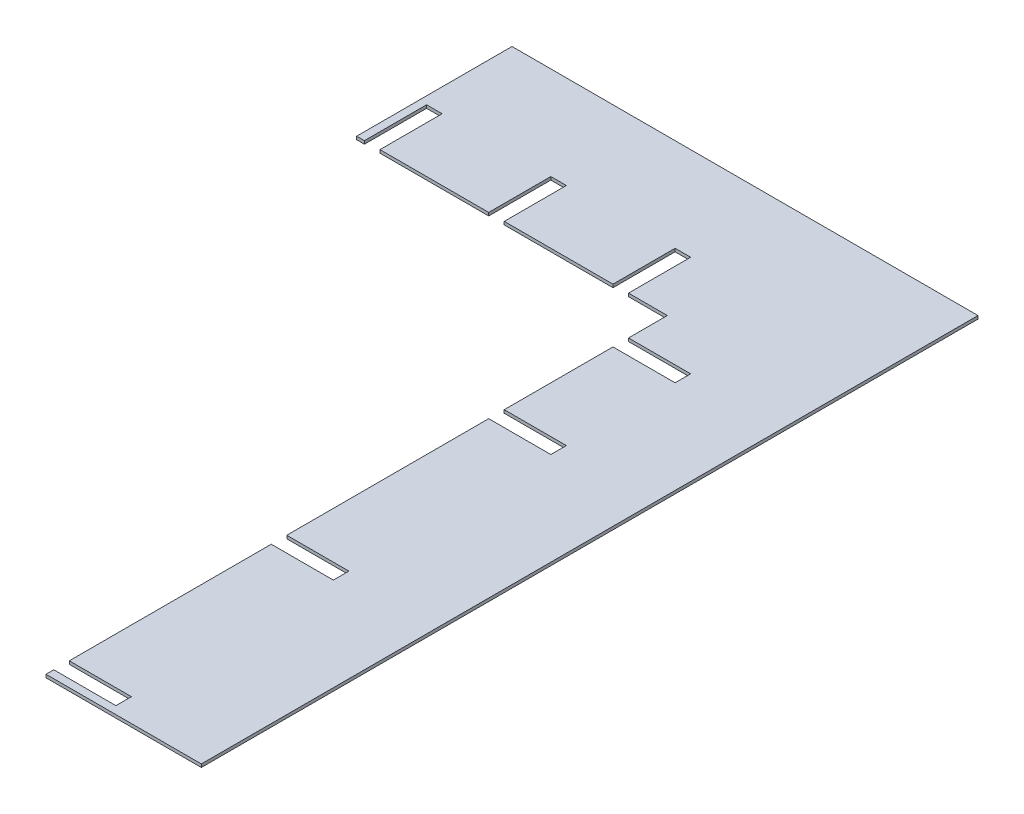
ISO-10303-21;
HEADER;
FILE_DESCRIPTION(('STEP AP214'),'2;1');
FILE_NAME('part.step','',(''),(''),'','','');
FILE_SCHEMA(('AUTOMOTIVE_DESIGN { 1 0 10303 214 1 1 1 1 }'));
ENDSEC;
DATA;
#1=APPLICATION_CONTEXT('core data for automotive mechanical design processes');
#2=APPLICATION_PROTOCOL_DEFINITION('international standard','automotive_design',2000,#1);
#3=PRODUCT_CONTEXT('',#1,'mechanical');
#4=PRODUCT('Part','Part','',(#3));
#5=PRODUCT_RELATED_PRODUCT_CATEGORY('part','',(#4));
#6=PRODUCT_DEFINITION_FORMATION('','',#4);
#7=PRODUCT_DEFINITION_CONTEXT('part definition',#1,'design');
#8=PRODUCT_DEFINITION('design','',#6,#7);
#9=PRODUCT_DEFINITION_SHAPE('','',#8);
#10=(LENGTH_UNIT() NAMED_UNIT(*) SI_UNIT(.MILLI.,.METRE.));
#11=(NAMED_UNIT(*) PLANE_ANGLE_UNIT() SI_UNIT($,.RADIAN.));
#12=(NAMED_UNIT(*) SI_UNIT($,.STERADIAN.) SOLID_ANGLE_UNIT());
#13=UNCERTAINTY_MEASURE_WITH_UNIT(LENGTH_MEASURE(1.E-05),#10,'distance_accuracy_value','');
#14=(GEOMETRIC_REPRESENTATION_CONTEXT(3) GLOBAL_UNCERTAINTY_ASSIGNED_CONTEXT((#13)) GLOBAL_UNIT_ASSIGNED_CONTEXT((#10,
#11,#12)) REPRESENTATION_CONTEXT('',''));
#15=CARTESIAN_POINT('',(0.,0.,0.));
#16=DIRECTION('',(0.,0.,1.));
#17=DIRECTION('',(1.,0.,0.));
#18=AXIS2_PLACEMENT_3D('',#15,#16,#17);
#19=CARTESIAN_POINT('',(0.,1.,-50.));
#20=DIRECTION('',(1.,0.,0.));
#21=DIRECTION('',(0.,0.,-1.));
#22=AXIS2_PLACEMENT_3D('',#19,#20,#21);
#23=PLANE('',#22);
#24=DIRECTION('',(0.,0.,1.));
#25=VECTOR('',#24,1.);
#26=CARTESIAN_POINT('',(0.,0.,-50.));
#27=LINE('',#26,#25);
#28=CARTESIAN_POINT('',(0.,0.,-50.));
#29=VERTEX_POINT('',#28);
#30=CARTESIAN_POINT('',(0.,0.,0.));
#31=VERTEX_POINT('',#30);
#32=EDGE_CURVE('E285',#29,#31,#27,.T.);
#33=ORIENTED_EDGE('',*,*,#32,.T.);
#34=DIRECTION('',(0.,-1.,0.));
#35=VECTOR('',#34,1.);
#36=CARTESIAN_POINT('',(0.,1.,0.));
#37=LINE('',#36,#35);
#38=CARTESIAN_POINT('',(0.,1.,0.));
#39=VERTEX_POINT('',#38);
#40=EDGE_CURVE('E11',#39,#31,#37,.T.);
#41=ORIENTED_EDGE('',*,*,#40,.F.);
#42=DIRECTION('',(0.,0.,1.));
#43=VECTOR('',#42,1.);
#44=CARTESIAN_POINT('',(0.,1.,-50.));
#45=LINE('',#44,#43);
#46=CARTESIAN_POINT('',(0.,1.,-50.));
#47=VERTEX_POINT('',#46);
#48=EDGE_CURVE('E351',#47,#39,#45,.T.);
#49=ORIENTED_EDGE('',*,*,#48,.F.);
#50=DIRECTION('',(0.,-1.,0.));
#51=VECTOR('',#50,1.);
#52=CARTESIAN_POINT('',(0.,1.,-50.));
#53=LINE('',#52,#51);
#54=EDGE_CURVE('E281',#47,#29,#53,.T.);
#55=ORIENTED_EDGE('',*,*,#54,.T.);
#56=EDGE_LOOP('',(#33,#41,#49,#55));
#57=FACE_BOUND('',#56,.T.);
#58=ADVANCED_FACE('F33',(#57),#23,.F.);
#59=CARTESIAN_POINT('',(0.,1.,0.));
#60=DIRECTION('',(0.,0.,-1.));
#61=DIRECTION('',(-1.,0.,0.));
#62=AXIS2_PLACEMENT_3D('',#59,#60,#61);
#63=PLANE('',#62);
#64=DIRECTION('',(1.,0.,0.));
#65=VECTOR('',#64,1.);
#66=CARTESIAN_POINT('',(0.,0.,0.));
#67=LINE('',#66,#65);
#68=CARTESIAN_POINT('',(2.5,0.,0.));
#69=VERTEX_POINT('',#68);
#70=EDGE_CURVE('E288',#31,#69,#67,.T.);
#71=ORIENTED_EDGE('',*,*,#70,.T.);
#72=DIRECTION('',(0.,-1.,0.));
#73=VECTOR('',#72,1.);
#74=CARTESIAN_POINT('',(2.5,1.,0.));
#75=LINE('',#74,#73);
#76=CARTESIAN_POINT('',(2.5,1.,0.));
#77=VERTEX_POINT('',#76);
#78=EDGE_CURVE('E41',#77,#69,#75,.T.);
#79=ORIENTED_EDGE('',*,*,#78,.F.);
#80=DIRECTION('',(1.,0.,0.));
#81=VECTOR('',#80,1.);
#82=CARTESIAN_POINT('',(0.,1.,0.));
#83=LINE('',#82,#81);
#84=EDGE_CURVE('E170',#39,#77,#83,.T.);
#85=ORIENTED_EDGE('',*,*,#84,.F.);
#86=ORIENTED_EDGE('',*,*,#40,.T.);
#87=EDGE_LOOP('',(#71,#79,#85,#86));
#88=FACE_BOUND('',#87,.T.);
#89=ADVANCED_FACE('F539',(#88),#63,.F.);
#90=CARTESIAN_POINT('',(2.5,1.,0.));
#91=DIRECTION('',(-1.,0.,0.));
#92=DIRECTION('',(0.,0.,1.));
#93=AXIS2_PLACEMENT_3D('',#90,#91,#92);
#94=PLANE('',#93);
#95=DIRECTION('',(0.,0.,-1.));
#96=VECTOR('',#95,1.);
#97=CARTESIAN_POINT('',(2.5,0.,0.));
#98=LINE('',#97,#96);
#99=CARTESIAN_POINT('',(2.5,0.,-20.));
#100=VERTEX_POINT('',#99);
#101=EDGE_CURVE('E290',#69,#100,#98,.T.);
#102=ORIENTED_EDGE('',*,*,#101,.T.);
#103=DIRECTION('',(0.,-1.,0.));
#104=VECTOR('',#103,1.);
#105=CARTESIAN_POINT('',(2.5,1.,-20.));
#106=LINE('',#105,#104);
#107=CARTESIAN_POINT('',(2.5,1.,-20.));
#108=VERTEX_POINT('',#107);
#109=EDGE_CURVE('E436',#108,#100,#106,.T.);
#110=ORIENTED_EDGE('',*,*,#109,.F.);
#111=DIRECTION('',(0.,0.,-1.));
#112=VECTOR('',#111,1.);
#113=CARTESIAN_POINT('',(2.5,1.,0.));
#114=LINE('',#113,#112);
#115=EDGE_CURVE('E444',#77,#108,#114,.T.);
#116=ORIENTED_EDGE('',*,*,#115,.F.);
#117=ORIENTED_EDGE('',*,*,#78,.T.);
#118=EDGE_LOOP('',(#102,#110,#116,#117));
#119=FACE_BOUND('',#118,.T.);
#120=ADVANCED_FACE('F442',(#119),#94,.F.);
#121=CARTESIAN_POINT('',(2.5,1.,-20.));
#122=DIRECTION('',(0.,0.,-1.));
#123=DIRECTION('',(-1.,0.,0.));
#124=AXIS2_PLACEMENT_3D('',#121,#122,#123);
#125=PLANE('',#124);
#126=DIRECTION('',(1.,0.,0.));
#127=VECTOR('',#126,1.);
#128=CARTESIAN_POINT('',(2.5,0.,-20.));
#129=LINE('',#128,#127);
#130=CARTESIAN_POINT('',(7.50000000000001,0.,-20.));
#131=VERTEX_POINT('',#130);
#132=EDGE_CURVE('E292',#100,#131,#129,.T.);
#133=ORIENTED_EDGE('',*,*,#132,.T.);
#134=DIRECTION('',(0.,-1.,0.));
#135=VECTOR('',#134,1.);
#136=CARTESIAN_POINT('',(7.50000000000001,1.,-20.));
#137=LINE('',#136,#135);
#138=CARTESIAN_POINT('',(7.50000000000001,1.,-20.));
#139=VERTEX_POINT('',#138);
#140=EDGE_CURVE('E433',#139,#131,#137,.T.);
#141=ORIENTED_EDGE('',*,*,#140,.F.);
#142=DIRECTION('',(1.,0.,0.));
#143=VECTOR('',#142,1.);
#144=CARTESIAN_POINT('',(2.5,1.,-20.));
#145=LINE('',#144,#143);
#146=EDGE_CURVE('E462',#108,#139,#145,.T.);
#147=ORIENTED_EDGE('',*,*,#146,.F.);
#148=ORIENTED_EDGE('',*,*,#109,.T.);
#149=EDGE_LOOP('',(#133,#141,#147,#148));
#150=FACE_BOUND('',#149,.T.);
#151=ADVANCED_FACE('F453',(#150),#125,.F.);
#152=CARTESIAN_POINT('',(7.50000000000001,1.,-20.));
#153=DIRECTION('',(1.,0.,0.));
#154=DIRECTION('',(0.,0.,-1.));
#155=AXIS2_PLACEMENT_3D('',#152,#153,#154);
#156=PLANE('',#155);
#157=DIRECTION('',(0.,0.,1.));
#158=VECTOR('',#157,1.);
#159=CARTESIAN_POINT('',(7.50000000000001,0.,-20.));
#160=LINE('',#159,#158);
#161=CARTESIAN_POINT('',(7.50000000000001,0.,0.));
#162=VERTEX_POINT('',#161);
#163=EDGE_CURVE('E294',#131,#162,#160,.T.);
#164=ORIENTED_EDGE('',*,*,#163,.T.);
#165=DIRECTION('',(0.,-1.,0.));
#166=VECTOR('',#165,1.);
#167=CARTESIAN_POINT('',(7.50000000000001,1.,0.));
#168=LINE('',#167,#166);
#169=CARTESIAN_POINT('',(7.50000000000001,1.,0.));
#170=VERTEX_POINT('',#169);
#171=EDGE_CURVE('E430',#170,#162,#168,.T.);
#172=ORIENTED_EDGE('',*,*,#171,.F.);
#173=DIRECTION('',(0.,0.,1.));
#174=VECTOR('',#173,1.);
#175=CARTESIAN_POINT('',(7.50000000000001,1.,-20.));
#176=LINE('',#175,#174);
#177=EDGE_CURVE('E459',#139,#170,#176,.T.);
#178=ORIENTED_EDGE('',*,*,#177,.F.);
#179=ORIENTED_EDGE('',*,*,#140,.T.);
#180=EDGE_LOOP('',(#164,#172,#178,#179));
#181=FACE_BOUND('',#180,.T.);
#182=ADVANCED_FACE('F457',(#181),#156,.F.);
#183=CARTESIAN_POINT('',(7.50000000000001,1.,0.));
#184=DIRECTION('',(0.,0.,-1.));
#185=DIRECTION('',(-1.,0.,0.));
#186=AXIS2_PLACEMENT_3D('',#183,#184,#185);
#187=PLANE('',#186);
#188=DIRECTION('',(1.,0.,0.));
#189=VECTOR('',#188,1.);
#190=CARTESIAN_POINT('',(7.50000000000001,0.,0.));
#191=LINE('',#190,#189);
#192=CARTESIAN_POINT('',(42.5,0.,0.));
#193=VERTEX_POINT('',#192);
#194=EDGE_CURVE('E296',#162,#193,#191,.T.);
#195=ORIENTED_EDGE('',*,*,#194,.T.);
#196=DIRECTION('',(0.,-1.,0.));
#197=VECTOR('',#196,1.);
#198=CARTESIAN_POINT('',(42.5,1.,0.));
#199=LINE('',#198,#197);
#200=CARTESIAN_POINT('',(42.5,1.,0.));
#201=VERTEX_POINT('',#200);
#202=EDGE_CURVE('E427',#201,#193,#199,.T.);
#203=ORIENTED_EDGE('',*,*,#202,.F.);
#204=DIRECTION('',(1.,0.,0.));
#205=VECTOR('',#204,1.);
#206=CARTESIAN_POINT('',(7.50000000000001,1.,0.));
#207=LINE('',#206,#205);
#208=EDGE_CURVE('E461',#170,#201,#207,.T.);
#209=ORIENTED_EDGE('',*,*,#208,.F.);
#210=ORIENTED_EDGE('',*,*,#171,.T.);
#211=EDGE_LOOP('',(#195,#203,#209,#210));
#212=FACE_BOUND('',#211,.T.);
#213=ADVANCED_FACE('F552',(#212),#187,.F.);
#214=CARTESIAN_POINT('',(42.5,1.,0.));
#215=DIRECTION('',(-1.,0.,0.));
#216=DIRECTION('',(0.,0.,1.));
#217=AXIS2_PLACEMENT_3D('',#214,#215,#216);
#218=PLANE('',#217);
#219=DIRECTION('',(0.,0.,-1.));
#220=VECTOR('',#219,1.);
#221=CARTESIAN_POINT('',(42.5,0.,0.));
#222=LINE('',#221,#220);
#223=CARTESIAN_POINT('',(42.5,0.,-20.));
#224=VERTEX_POINT('',#223);
#225=EDGE_CURVE('E298',#193,#224,#222,.T.);
#226=ORIENTED_EDGE('',*,*,#225,.T.);
#227=DIRECTION('',(0.,-1.,0.));
#228=VECTOR('',#227,1.);
#229=CARTESIAN_POINT('',(42.5,1.,-20.));
#230=LINE('',#229,#228);
#231=CARTESIAN_POINT('',(42.5,1.,-20.));
#232=VERTEX_POINT('',#231);
#233=EDGE_CURVE('E424',#232,#224,#230,.T.);
#234=ORIENTED_EDGE('',*,*,#233,.F.);
#235=DIRECTION('',(0.,0.,-1.));
#236=VECTOR('',#235,1.);
#237=CARTESIAN_POINT('',(42.5,1.,0.));
#238=LINE('',#237,#236);
#239=EDGE_CURVE('E464',#201,#232,#238,.T.);
#240=ORIENTED_EDGE('',*,*,#239,.F.);
#241=ORIENTED_EDGE('',*,*,#202,.T.);
#242=EDGE_LOOP('',(#226,#234,#240,#241));
#243=FACE_BOUND('',#242,.T.);
#244=ADVANCED_FACE('F555',(#243),#218,.F.);
#245=CARTESIAN_POINT('',(42.5,1.,-20.));
#246=DIRECTION('',(0.,0.,-1.));
#247=DIRECTION('',(-1.,0.,0.));
#248=AXIS2_PLACEMENT_3D('',#245,#246,#247);
#249=PLANE('',#248);
#250=DIRECTION('',(1.,0.,0.));
#251=VECTOR('',#250,1.);
#252=CARTESIAN_POINT('',(42.5,0.,-20.));
#253=LINE('',#252,#251);
#254=CARTESIAN_POINT('',(47.5,0.,-20.));
#255=VERTEX_POINT('',#254);
#256=EDGE_CURVE('E300',#224,#255,#253,.T.);
#257=ORIENTED_EDGE('',*,*,#256,.T.);
#258=DIRECTION('',(0.,-1.,0.));
#259=VECTOR('',#258,1.);
#260=CARTESIAN_POINT('',(47.5,1.,-20.));
#261=LINE('',#260,#259);
#262=CARTESIAN_POINT('',(47.5,1.,-20.));
#263=VERTEX_POINT('',#262);
#264=EDGE_CURVE('E421',#263,#255,#261,.T.);
#265=ORIENTED_EDGE('',*,*,#264,.F.);
#266=DIRECTION('',(1.,0.,0.));
#267=VECTOR('',#266,1.);
#268=CARTESIAN_POINT('',(42.5,1.,-20.));
#269=LINE('',#268,#267);
#270=EDGE_CURVE('E470',#232,#263,#269,.T.);
#271=ORIENTED_EDGE('',*,*,#270,.F.);
#272=ORIENTED_EDGE('',*,*,#233,.T.);
#273=EDGE_LOOP('',(#257,#265,#271,#272));
#274=FACE_BOUND('',#273,.T.);
#275=ADVANCED_FACE('F559',(#274),#249,.F.);
#276=CARTESIAN_POINT('',(47.5,1.,-20.));
#277=DIRECTION('',(1.,0.,0.));
#278=DIRECTION('',(0.,0.,-1.));
#279=AXIS2_PLACEMENT_3D('',#276,#277,#278);
#280=PLANE('',#279);
#281=DIRECTION('',(0.,0.,1.));
#282=VECTOR('',#281,1.);
#283=CARTESIAN_POINT('',(47.5,0.,-20.));
#284=LINE('',#283,#282);
#285=CARTESIAN_POINT('',(47.5,0.,0.));
#286=VERTEX_POINT('',#285);
#287=EDGE_CURVE('E302',#255,#286,#284,.T.);
#288=ORIENTED_EDGE('',*,*,#287,.T.);
#289=DIRECTION('',(0.,-1.,0.));
#290=VECTOR('',#289,1.);
#291=CARTESIAN_POINT('',(47.5,1.,0.));
#292=LINE('',#291,#290);
#293=CARTESIAN_POINT('',(47.5,1.,0.));
#294=VERTEX_POINT('',#293);
#295=EDGE_CURVE('E418',#294,#286,#292,.T.);
#296=ORIENTED_EDGE('',*,*,#295,.F.);
#297=DIRECTION('',(0.,0.,1.));
#298=VECTOR('',#297,1.);
#299=CARTESIAN_POINT('',(47.5,1.,-20.));
#300=LINE('',#299,#298);
#301=EDGE_CURVE('E472',#263,#294,#300,.T.);
#302=ORIENTED_EDGE('',*,*,#301,.F.);
#303=ORIENTED_EDGE('',*,*,#264,.T.);
#304=EDGE_LOOP('',(#288,#296,#302,#303));
#305=FACE_BOUND('',#304,.T.);
#306=ADVANCED_FACE('F563',(#305),#280,.F.);
#307=CARTESIAN_POINT('',(47.5,1.,0.));
#308=DIRECTION('',(0.,0.,-1.));
#309=DIRECTION('',(-1.,0.,0.));
#310=AXIS2_PLACEMENT_3D('',#307,#308,#309);
#311=PLANE('',#310);
#312=DIRECTION('',(1.,0.,0.));
#313=VECTOR('',#312,1.);
#314=CARTESIAN_POINT('',(47.5,0.,0.));
#315=LINE('',#314,#313);
#316=CARTESIAN_POINT('',(82.5,0.,0.));
#317=VERTEX_POINT('',#316);
#318=EDGE_CURVE('E304',#286,#317,#315,.T.);
#319=ORIENTED_EDGE('',*,*,#318,.T.);
#320=DIRECTION('',(0.,-1.,0.));
#321=VECTOR('',#320,1.);
#322=CARTESIAN_POINT('',(82.5,1.,0.));
#323=LINE('',#322,#321);
#324=CARTESIAN_POINT('',(82.5,1.,0.));
#325=VERTEX_POINT('',#324);
#326=EDGE_CURVE('E415',#325,#317,#323,.T.);
#327=ORIENTED_EDGE('',*,*,#326,.F.);
#328=DIRECTION('',(1.,0.,0.));
#329=VECTOR('',#328,1.);
#330=CARTESIAN_POINT('',(47.5,1.,0.));
#331=LINE('',#330,#329);
#332=EDGE_CURVE('E474',#294,#325,#331,.T.);
#333=ORIENTED_EDGE('',*,*,#332,.F.);
#334=ORIENTED_EDGE('',*,*,#295,.T.);
#335=EDGE_LOOP('',(#319,#327,#333,#334));
#336=FACE_BOUND('',#335,.T.);
#337=ADVANCED_FACE('F567',(#336),#311,.F.);
#338=CARTESIAN_POINT('',(82.5,1.,0.));
#339=DIRECTION('',(-1.,0.,0.));
#340=DIRECTION('',(0.,0.,1.));
#341=AXIS2_PLACEMENT_3D('',#338,#339,#340);
#342=PLANE('',#341);
#343=DIRECTION('',(0.,0.,-1.));
#344=VECTOR('',#343,1.);
#345=CARTESIAN_POINT('',(82.5,0.,0.));
#346=LINE('',#345,#344);
#347=CARTESIAN_POINT('',(82.5,0.,-20.));
#348=VERTEX_POINT('',#347);
#349=EDGE_CURVE('E306',#317,#348,#346,.T.);
#350=ORIENTED_EDGE('',*,*,#349,.T.);
#351=DIRECTION('',(0.,-1.,0.));
#352=VECTOR('',#351,1.);
#353=CARTESIAN_POINT('',(82.5,1.,-20.));
#354=LINE('',#353,#352);
#355=CARTESIAN_POINT('',(82.5,1.,-20.));
#356=VERTEX_POINT('',#355);
#357=EDGE_CURVE('E412',#356,#348,#354,.T.);
#358=ORIENTED_EDGE('',*,*,#357,.F.);
#359=DIRECTION('',(0.,0.,-1.));
#360=VECTOR('',#359,1.);
#361=CARTESIAN_POINT('',(82.5,1.,0.));
#362=LINE('',#361,#360);
#363=EDGE_CURVE('E476',#325,#356,#362,.T.);
#364=ORIENTED_EDGE('',*,*,#363,.F.);
#365=ORIENTED_EDGE('',*,*,#326,.T.);
#366=EDGE_LOOP('',(#350,#358,#364,#365));
#367=FACE_BOUND('',#366,.T.);
#368=ADVANCED_FACE('F571',(#367),#342,.F.);
#369=CARTESIAN_POINT('',(82.5,1.,-20.));
#370=DIRECTION('',(0.,0.,-1.));
#371=DIRECTION('',(-1.,0.,0.));
#372=AXIS2_PLACEMENT_3D('',#369,#370,#371);
#373=PLANE('',#372);
#374=DIRECTION('',(1.,0.,0.));
#375=VECTOR('',#374,1.);
#376=CARTESIAN_POINT('',(82.5,0.,-20.));
#377=LINE('',#376,#375);
#378=CARTESIAN_POINT('',(87.5,0.,-20.));
#379=VERTEX_POINT('',#378);
#380=EDGE_CURVE('E308',#348,#379,#377,.T.);
#381=ORIENTED_EDGE('',*,*,#380,.T.);
#382=DIRECTION('',(0.,-1.,0.));
#383=VECTOR('',#382,1.);
#384=CARTESIAN_POINT('',(87.5,1.,-20.));
#385=LINE('',#384,#383);
#386=CARTESIAN_POINT('',(87.5,1.,-20.));
#387=VERTEX_POINT('',#386);
#388=EDGE_CURVE('E409',#387,#379,#385,.T.);
#389=ORIENTED_EDGE('',*,*,#388,.F.);
#390=DIRECTION('',(1.,0.,0.));
#391=VECTOR('',#390,1.);
#392=CARTESIAN_POINT('',(82.5,1.,-20.));
#393=LINE('',#392,#391);
#394=EDGE_CURVE('E478',#356,#387,#393,.T.);
#395=ORIENTED_EDGE('',*,*,#394,.F.);
#396=ORIENTED_EDGE('',*,*,#357,.T.);
#397=EDGE_LOOP('',(#381,#389,#395,#396));
#398=FACE_BOUND('',#397,.T.);
#399=ADVANCED_FACE('F575',(#398),#373,.F.);
#400=CARTESIAN_POINT('',(87.5,1.,-20.));
#401=DIRECTION('',(1.,0.,0.));
#402=DIRECTION('',(0.,0.,-1.));
#403=AXIS2_PLACEMENT_3D('',#400,#401,#402);
#404=PLANE('',#403);
#405=DIRECTION('',(0.,0.,1.));
#406=VECTOR('',#405,1.);
#407=CARTESIAN_POINT('',(87.5,0.,-20.));
#408=LINE('',#407,#406);
#409=CARTESIAN_POINT('',(87.5,0.,0.));
#410=VERTEX_POINT('',#409);
#411=EDGE_CURVE('E310',#379,#410,#408,.T.);
#412=ORIENTED_EDGE('',*,*,#411,.T.);
#413=DIRECTION('',(0.,-1.,0.));
#414=VECTOR('',#413,1.);
#415=CARTESIAN_POINT('',(87.5,1.,0.));
#416=LINE('',#415,#414);
#417=CARTESIAN_POINT('',(87.5,1.,0.));
#418=VERTEX_POINT('',#417);
#419=EDGE_CURVE('E406',#418,#410,#416,.T.);
#420=ORIENTED_EDGE('',*,*,#419,.F.);
#421=DIRECTION('',(0.,0.,1.));
#422=VECTOR('',#421,1.);
#423=CARTESIAN_POINT('',(87.5,1.,-20.));
#424=LINE('',#423,#422);
#425=EDGE_CURVE('E480',#387,#418,#424,.T.);
#426=ORIENTED_EDGE('',*,*,#425,.F.);
#427=ORIENTED_EDGE('',*,*,#388,.T.);
#428=EDGE_LOOP('',(#412,#420,#426,#427));
#429=FACE_BOUND('',#428,.T.);
#430=ADVANCED_FACE('F579',(#429),#404,.F.);
#431=CARTESIAN_POINT('',(87.5,1.,0.));
#432=DIRECTION('',(0.,0.,-1.));
#433=DIRECTION('',(-1.,0.,0.));
#434=AXIS2_PLACEMENT_3D('',#431,#432,#433);
#435=PLANE('',#434);
#436=DIRECTION('',(1.,0.,0.));
#437=VECTOR('',#436,1.);
#438=CARTESIAN_POINT('',(87.5,0.,0.));
#439=LINE('',#438,#437);
#440=CARTESIAN_POINT('',(100.,0.,0.));
#441=VERTEX_POINT('',#440);
#442=EDGE_CURVE('E312',#410,#441,#439,.T.);
#443=ORIENTED_EDGE('',*,*,#442,.T.);
#444=DIRECTION('',(0.,-1.,0.));
#445=VECTOR('',#444,1.);
#446=CARTESIAN_POINT('',(100.,1.,0.));
#447=LINE('',#446,#445);
#448=CARTESIAN_POINT('',(100.,1.,0.));
#449=VERTEX_POINT('',#448);
#450=EDGE_CURVE('E403',#449,#441,#447,.T.);
#451=ORIENTED_EDGE('',*,*,#450,.F.);
#452=DIRECTION('',(1.,0.,0.));
#453=VECTOR('',#452,1.);
#454=CARTESIAN_POINT('',(87.5,1.,0.));
#455=LINE('',#454,#453);
#456=EDGE_CURVE('E482',#418,#449,#455,.T.);
#457=ORIENTED_EDGE('',*,*,#456,.F.);
#458=ORIENTED_EDGE('',*,*,#419,.T.);
#459=EDGE_LOOP('',(#443,#451,#457,#458));
#460=FACE_BOUND('',#459,.T.);
#461=ADVANCED_FACE('F583',(#460),#435,.F.);
#462=CARTESIAN_POINT('',(100.,1.,0.));
#463=DIRECTION('',(1.,0.,0.));
#464=DIRECTION('',(0.,0.,-1.));
#465=AXIS2_PLACEMENT_3D('',#462,#463,#464);
#466=PLANE('',#465);
#467=DIRECTION('',(0.,0.,1.));
#468=VECTOR('',#467,1.);
#469=CARTESIAN_POINT('',(100.,0.,0.));
#470=LINE('',#469,#468);
#471=CARTESIAN_POINT('',(100.,0.,12.5));
#472=VERTEX_POINT('',#471);
#473=EDGE_CURVE('E314',#441,#472,#470,.T.);
#474=ORIENTED_EDGE('',*,*,#473,.T.);
#475=DIRECTION('',(0.,-1.,0.));
#476=VECTOR('',#475,1.);
#477=CARTESIAN_POINT('',(100.,1.,12.5));
#478=LINE('',#477,#476);
#479=CARTESIAN_POINT('',(100.,1.,12.5));
#480=VERTEX_POINT('',#479);
#481=EDGE_CURVE('E400',#480,#472,#478,.T.);
#482=ORIENTED_EDGE('',*,*,#481,.F.);
#483=DIRECTION('',(0.,0.,1.));
#484=VECTOR('',#483,1.);
#485=CARTESIAN_POINT('',(100.,1.,0.));
#486=LINE('',#485,#484);
#487=EDGE_CURVE('E484',#449,#480,#486,.T.);
#488=ORIENTED_EDGE('',*,*,#487,.F.);
#489=ORIENTED_EDGE('',*,*,#450,.T.);
#490=EDGE_LOOP('',(#474,#482,#488,#489));
#491=FACE_BOUND('',#490,.T.);
#492=ADVANCED_FACE('F587',(#491),#466,.F.);
#493=CARTESIAN_POINT('',(120.,1.,12.5));
#494=DIRECTION('',(0.,0.,-1.));
#495=DIRECTION('',(-1.,0.,0.));
#496=AXIS2_PLACEMENT_3D('',#493,#494,#495);
#497=PLANE('',#496);
#498=DIRECTION('',(1.,0.,0.));
#499=VECTOR('',#498,1.);
#500=CARTESIAN_POINT('',(120.,0.,12.5));
#501=LINE('',#500,#499);
#502=CARTESIAN_POINT('',(120.,0.,12.5));
#503=VERTEX_POINT('',#502);
#504=EDGE_CURVE('E316',#472,#503,#501,.T.);
#505=ORIENTED_EDGE('',*,*,#504,.T.);
#506=DIRECTION('',(0.,-1.,0.));
#507=VECTOR('',#506,1.);
#508=CARTESIAN_POINT('',(120.,1.,12.5));
#509=LINE('',#508,#507);
#510=CARTESIAN_POINT('',(120.,1.,12.5));
#511=VERTEX_POINT('',#510);
#512=EDGE_CURVE('E397',#511,#503,#509,.T.);
#513=ORIENTED_EDGE('',*,*,#512,.F.);
#514=DIRECTION('',(1.,0.,0.));
#515=VECTOR('',#514,1.);
#516=CARTESIAN_POINT('',(120.,1.,12.5));
#517=LINE('',#516,#515);
#518=EDGE_CURVE('E486',#480,#511,#517,.T.);
#519=ORIENTED_EDGE('',*,*,#518,.F.);
#520=ORIENTED_EDGE('',*,*,#481,.T.);
#521=EDGE_LOOP('',(#505,#513,#519,#520));
#522=FACE_BOUND('',#521,.T.);
#523=ADVANCED_FACE('F591',(#522),#497,.F.);
#524=CARTESIAN_POINT('',(120.,1.,17.5));
#525=DIRECTION('',(1.,0.,0.));
#526=DIRECTION('',(0.,0.,-1.));
#527=AXIS2_PLACEMENT_3D('',#524,#525,#526);
#528=PLANE('',#527);
#529=DIRECTION('',(0.,0.,1.));
#530=VECTOR('',#529,1.);
#531=CARTESIAN_POINT('',(120.,0.,17.5));
#532=LINE('',#531,#530);
#533=CARTESIAN_POINT('',(120.,0.,17.5));
#534=VERTEX_POINT('',#533);
#535=EDGE_CURVE('E318',#503,#534,#532,.T.);
#536=ORIENTED_EDGE('',*,*,#535,.T.);
#537=DIRECTION('',(0.,-1.,0.));
#538=VECTOR('',#537,1.);
#539=CARTESIAN_POINT('',(120.,1.,17.5));
#540=LINE('',#539,#538);
#541=CARTESIAN_POINT('',(120.,1.,17.5));
#542=VERTEX_POINT('',#541);
#543=EDGE_CURVE('E394',#542,#534,#540,.T.);
#544=ORIENTED_EDGE('',*,*,#543,.F.);
#545=DIRECTION('',(0.,0.,1.));
#546=VECTOR('',#545,1.);
#547=CARTESIAN_POINT('',(120.,1.,17.5));
#548=LINE('',#547,#546);
#549=EDGE_CURVE('E488',#511,#542,#548,.T.);
#550=ORIENTED_EDGE('',*,*,#549,.F.);
#551=ORIENTED_EDGE('',*,*,#512,.T.);
#552=EDGE_LOOP('',(#536,#544,#550,#551));
#553=FACE_BOUND('',#552,.T.);
#554=ADVANCED_FACE('F595',(#553),#528,.F.);
#555=CARTESIAN_POINT('',(100.,1.,17.5));
#556=DIRECTION('',(0.,0.,1.));
#557=DIRECTION('',(1.,0.,0.));
#558=AXIS2_PLACEMENT_3D('',#555,#556,#557);
#559=PLANE('',#558);
#560=DIRECTION('',(-1.,0.,0.));
#561=VECTOR('',#560,1.);
#562=CARTESIAN_POINT('',(100.,0.,17.5));
#563=LINE('',#562,#561);
#564=CARTESIAN_POINT('',(100.,0.,17.5));
#565=VERTEX_POINT('',#564);
#566=EDGE_CURVE('E320',#534,#565,#563,.T.);
#567=ORIENTED_EDGE('',*,*,#566,.T.);
#568=DIRECTION('',(0.,-1.,0.));
#569=VECTOR('',#568,1.);
#570=CARTESIAN_POINT('',(100.,1.,17.5));
#571=LINE('',#570,#569);
#572=CARTESIAN_POINT('',(100.,1.,17.5));
#573=VERTEX_POINT('',#572);
#574=EDGE_CURVE('E391',#573,#565,#571,.T.);
#575=ORIENTED_EDGE('',*,*,#574,.F.);
#576=DIRECTION('',(-1.,0.,0.));
#577=VECTOR('',#576,1.);
#578=CARTESIAN_POINT('',(100.,1.,17.5));
#579=LINE('',#578,#577);
#580=EDGE_CURVE('E490',#542,#573,#579,.T.);
#581=ORIENTED_EDGE('',*,*,#580,.F.);
#582=ORIENTED_EDGE('',*,*,#543,.T.);
#583=EDGE_LOOP('',(#567,#575,#581,#582));
#584=FACE_BOUND('',#583,.T.);
#585=ADVANCED_FACE('F599',(#584),#559,.F.);
#586=CARTESIAN_POINT('',(100.,1.,17.5));
#587=DIRECTION('',(1.,0.,0.));
#588=DIRECTION('',(0.,0.,-1.));
#589=AXIS2_PLACEMENT_3D('',#586,#587,#588);
#590=PLANE('',#589);
#591=DIRECTION('',(0.,0.,1.));
#592=VECTOR('',#591,1.);
#593=CARTESIAN_POINT('',(100.,0.,17.5));
#594=LINE('',#593,#592);
#595=CARTESIAN_POINT('',(100.,0.,52.5));
#596=VERTEX_POINT('',#595);
#597=EDGE_CURVE('E322',#565,#596,#594,.T.);
#598=ORIENTED_EDGE('',*,*,#597,.T.);
#599=DIRECTION('',(0.,-1.,0.));
#600=VECTOR('',#599,1.);
#601=CARTESIAN_POINT('',(100.,1.,52.5));
#602=LINE('',#601,#600);
#603=CARTESIAN_POINT('',(100.,1.,52.5));
#604=VERTEX_POINT('',#603);
#605=EDGE_CURVE('E388',#604,#596,#602,.T.);
#606=ORIENTED_EDGE('',*,*,#605,.F.);
#607=DIRECTION('',(0.,0.,1.));
#608=VECTOR('',#607,1.);
#609=CARTESIAN_POINT('',(100.,1.,17.5));
#610=LINE('',#609,#608);
#611=EDGE_CURVE('E492',#573,#604,#610,.T.);
#612=ORIENTED_EDGE('',*,*,#611,.F.);
#613=ORIENTED_EDGE('',*,*,#574,.T.);
#614=EDGE_LOOP('',(#598,#606,#612,#613));
#615=FACE_BOUND('',#614,.T.);
#616=ADVANCED_FACE('F603',(#615),#590,.F.);
#617=CARTESIAN_POINT('',(120.,1.,52.5));
#618=DIRECTION('',(0.,0.,-1.));
#619=DIRECTION('',(-1.,0.,0.));
#620=AXIS2_PLACEMENT_3D('',#617,#618,#619);
#621=PLANE('',#620);
#622=DIRECTION('',(1.,0.,0.));
#623=VECTOR('',#622,1.);
#624=CARTESIAN_POINT('',(120.,0.,52.5));
#625=LINE('',#624,#623);
#626=CARTESIAN_POINT('',(120.,0.,52.5));
#627=VERTEX_POINT('',#626);
#628=EDGE_CURVE('E324',#596,#627,#625,.T.);
#629=ORIENTED_EDGE('',*,*,#628,.T.);
#630=DIRECTION('',(0.,-1.,0.));
#631=VECTOR('',#630,1.);
#632=CARTESIAN_POINT('',(120.,1.,52.5));
#633=LINE('',#632,#631);
#634=CARTESIAN_POINT('',(120.,1.,52.5));
#635=VERTEX_POINT('',#634);
#636=EDGE_CURVE('E385',#635,#627,#633,.T.);
#637=ORIENTED_EDGE('',*,*,#636,.F.);
#638=DIRECTION('',(1.,0.,0.));
#639=VECTOR('',#638,1.);
#640=CARTESIAN_POINT('',(120.,1.,52.5));
#641=LINE('',#640,#639);
#642=EDGE_CURVE('E494',#604,#635,#641,.T.);
#643=ORIENTED_EDGE('',*,*,#642,.F.);
#644=ORIENTED_EDGE('',*,*,#605,.T.);
#645=EDGE_LOOP('',(#629,#637,#643,#644));
#646=FACE_BOUND('',#645,.T.);
#647=ADVANCED_FACE('F607',(#646),#621,.F.);
#648=CARTESIAN_POINT('',(120.,1.,57.5));
#649=DIRECTION('',(1.,0.,0.));
#650=DIRECTION('',(0.,0.,-1.));
#651=AXIS2_PLACEMENT_3D('',#648,#649,#650);
#652=PLANE('',#651);
#653=DIRECTION('',(0.,0.,1.));
#654=VECTOR('',#653,1.);
#655=CARTESIAN_POINT('',(120.,0.,57.5));
#656=LINE('',#655,#654);
#657=CARTESIAN_POINT('',(120.,0.,57.5));
#658=VERTEX_POINT('',#657);
#659=EDGE_CURVE('E326',#627,#658,#656,.T.);
#660=ORIENTED_EDGE('',*,*,#659,.T.);
#661=DIRECTION('',(0.,-1.,0.));
#662=VECTOR('',#661,1.);
#663=CARTESIAN_POINT('',(120.,1.,57.5));
#664=LINE('',#663,#662);
#665=CARTESIAN_POINT('',(120.,1.,57.5));
#666=VERTEX_POINT('',#665);
#667=EDGE_CURVE('E382',#666,#658,#664,.T.);
#668=ORIENTED_EDGE('',*,*,#667,.F.);
#669=DIRECTION('',(0.,0.,1.));
#670=VECTOR('',#669,1.);
#671=CARTESIAN_POINT('',(120.,1.,57.5));
#672=LINE('',#671,#670);
#673=EDGE_CURVE('E496',#635,#666,#672,.T.);
#674=ORIENTED_EDGE('',*,*,#673,.F.);
#675=ORIENTED_EDGE('',*,*,#636,.T.);
#676=EDGE_LOOP('',(#660,#668,#674,#675));
#677=FACE_BOUND('',#676,.T.);
#678=ADVANCED_FACE('F611',(#677),#652,.F.);
#679=CARTESIAN_POINT('',(100.,1.,57.5));
#680=DIRECTION('',(0.,0.,1.));
#681=DIRECTION('',(1.,0.,0.));
#682=AXIS2_PLACEMENT_3D('',#679,#680,#681);
#683=PLANE('',#682);
#684=DIRECTION('',(-1.,0.,0.));
#685=VECTOR('',#684,1.);
#686=CARTESIAN_POINT('',(100.,0.,57.5));
#687=LINE('',#686,#685);
#688=CARTESIAN_POINT('',(100.,0.,57.5));
#689=VERTEX_POINT('',#688);
#690=EDGE_CURVE('E328',#658,#689,#687,.T.);
#691=ORIENTED_EDGE('',*,*,#690,.T.);
#692=DIRECTION('',(0.,-1.,0.));
#693=VECTOR('',#692,1.);
#694=CARTESIAN_POINT('',(100.,1.,57.5));
#695=LINE('',#694,#693);
#696=CARTESIAN_POINT('',(100.,1.,57.5));
#697=VERTEX_POINT('',#696);
#698=EDGE_CURVE('E379',#697,#689,#695,.T.);
#699=ORIENTED_EDGE('',*,*,#698,.F.);
#700=DIRECTION('',(-1.,0.,0.));
#701=VECTOR('',#700,1.);
#702=CARTESIAN_POINT('',(100.,1.,57.5));
#703=LINE('',#702,#701);
#704=EDGE_CURVE('E498',#666,#697,#703,.T.);
#705=ORIENTED_EDGE('',*,*,#704,.F.);
#706=ORIENTED_EDGE('',*,*,#667,.T.);
#707=EDGE_LOOP('',(#691,#699,#705,#706));
#708=FACE_BOUND('',#707,.T.);
#709=ADVANCED_FACE('F615',(#708),#683,.F.);
#710=CARTESIAN_POINT('',(100.,1.,57.5));
#711=DIRECTION('',(1.,0.,0.));
#712=DIRECTION('',(0.,0.,-1.));
#713=AXIS2_PLACEMENT_3D('',#710,#711,#712);
#714=PLANE('',#713);
#715=DIRECTION('',(0.,0.,1.));
#716=VECTOR('',#715,1.);
#717=CARTESIAN_POINT('',(100.,0.,57.5));
#718=LINE('',#717,#716);
#719=CARTESIAN_POINT('',(100.,0.,122.5));
#720=VERTEX_POINT('',#719);
#721=EDGE_CURVE('E330',#689,#720,#718,.T.);
#722=ORIENTED_EDGE('',*,*,#721,.T.);
#723=DIRECTION('',(0.,-1.,0.));
#724=VECTOR('',#723,1.);
#725=CARTESIAN_POINT('',(100.,1.,122.5));
#726=LINE('',#725,#724);
#727=CARTESIAN_POINT('',(100.,1.,122.5));
#728=VERTEX_POINT('',#727);
#729=EDGE_CURVE('E376',#728,#720,#726,.T.);
#730=ORIENTED_EDGE('',*,*,#729,.F.);
#731=DIRECTION('',(0.,0.,1.));
#732=VECTOR('',#731,1.);
#733=CARTESIAN_POINT('',(100.,1.,57.5));
#734=LINE('',#733,#732);
#735=EDGE_CURVE('E500',#697,#728,#734,.T.);
#736=ORIENTED_EDGE('',*,*,#735,.F.);
#737=ORIENTED_EDGE('',*,*,#698,.T.);
#738=EDGE_LOOP('',(#722,#730,#736,#737));
#739=FACE_BOUND('',#738,.T.);
#740=ADVANCED_FACE('F619',(#739),#714,.F.);
#741=CARTESIAN_POINT('',(120.,1.,122.5));
#742=DIRECTION('',(0.,0.,-1.));
#743=DIRECTION('',(-1.,0.,0.));
#744=AXIS2_PLACEMENT_3D('',#741,#742,#743);
#745=PLANE('',#744);
#746=DIRECTION('',(1.,0.,0.));
#747=VECTOR('',#746,1.);
#748=CARTESIAN_POINT('',(120.,0.,122.5));
#749=LINE('',#748,#747);
#750=CARTESIAN_POINT('',(120.,0.,122.5));
#751=VERTEX_POINT('',#750);
#752=EDGE_CURVE('E332',#720,#751,#749,.T.);
#753=ORIENTED_EDGE('',*,*,#752,.T.);
#754=DIRECTION('',(0.,-1.,0.));
#755=VECTOR('',#754,1.);
#756=CARTESIAN_POINT('',(120.,1.,122.5));
#757=LINE('',#756,#755);
#758=CARTESIAN_POINT('',(120.,1.,122.5));
#759=VERTEX_POINT('',#758);
#760=EDGE_CURVE('E373',#759,#751,#757,.T.);
#761=ORIENTED_EDGE('',*,*,#760,.F.);
#762=DIRECTION('',(1.,0.,0.));
#763=VECTOR('',#762,1.);
#764=CARTESIAN_POINT('',(120.,1.,122.5));
#765=LINE('',#764,#763);
#766=EDGE_CURVE('E502',#728,#759,#765,.T.);
#767=ORIENTED_EDGE('',*,*,#766,.F.);
#768=ORIENTED_EDGE('',*,*,#729,.T.);
#769=EDGE_LOOP('',(#753,#761,#767,#768));
#770=FACE_BOUND('',#769,.T.);
#771=ADVANCED_FACE('F623',(#770),#745,.F.);
#772=CARTESIAN_POINT('',(120.,1.,127.5));
#773=DIRECTION('',(1.,0.,0.));
#774=DIRECTION('',(0.,0.,-1.));
#775=AXIS2_PLACEMENT_3D('',#772,#773,#774);
#776=PLANE('',#775);
#777=DIRECTION('',(0.,0.,1.));
#778=VECTOR('',#777,1.);
#779=CARTESIAN_POINT('',(120.,0.,127.5));
#780=LINE('',#779,#778);
#781=CARTESIAN_POINT('',(120.,0.,127.5));
#782=VERTEX_POINT('',#781);
#783=EDGE_CURVE('E334',#751,#782,#780,.T.);
#784=ORIENTED_EDGE('',*,*,#783,.T.);
#785=DIRECTION('',(0.,-1.,0.));
#786=VECTOR('',#785,1.);
#787=CARTESIAN_POINT('',(120.,1.,127.5));
#788=LINE('',#787,#786);
#789=CARTESIAN_POINT('',(120.,1.,127.5));
#790=VERTEX_POINT('',#789);
#791=EDGE_CURVE('E370',#790,#782,#788,.T.);
#792=ORIENTED_EDGE('',*,*,#791,.F.);
#793=DIRECTION('',(0.,0.,1.));
#794=VECTOR('',#793,1.);
#795=CARTESIAN_POINT('',(120.,1.,127.5));
#796=LINE('',#795,#794);
#797=EDGE_CURVE('E504',#759,#790,#796,.T.);
#798=ORIENTED_EDGE('',*,*,#797,.F.);
#799=ORIENTED_EDGE('',*,*,#760,.T.);
#800=EDGE_LOOP('',(#784,#792,#798,#799));
#801=FACE_BOUND('',#800,.T.);
#802=ADVANCED_FACE('F627',(#801),#776,.F.);
#803=CARTESIAN_POINT('',(100.,1.,127.5));
#804=DIRECTION('',(0.,0.,1.));
#805=DIRECTION('',(1.,0.,0.));
#806=AXIS2_PLACEMENT_3D('',#803,#804,#805);
#807=PLANE('',#806);
#808=DIRECTION('',(-1.,0.,0.));
#809=VECTOR('',#808,1.);
#810=CARTESIAN_POINT('',(100.,0.,127.5));
#811=LINE('',#810,#809);
#812=CARTESIAN_POINT('',(100.,0.,127.5));
#813=VERTEX_POINT('',#812);
#814=EDGE_CURVE('E336',#782,#813,#811,.T.);
#815=ORIENTED_EDGE('',*,*,#814,.T.);
#816=DIRECTION('',(0.,-1.,0.));
#817=VECTOR('',#816,1.);
#818=CARTESIAN_POINT('',(100.,1.,127.5));
#819=LINE('',#818,#817);
#820=CARTESIAN_POINT('',(100.,1.,127.5));
#821=VERTEX_POINT('',#820);
#822=EDGE_CURVE('E367',#821,#813,#819,.T.);
#823=ORIENTED_EDGE('',*,*,#822,.F.);
#824=DIRECTION('',(-1.,0.,0.));
#825=VECTOR('',#824,1.);
#826=CARTESIAN_POINT('',(100.,1.,127.5));
#827=LINE('',#826,#825);
#828=EDGE_CURVE('E506',#790,#821,#827,.T.);
#829=ORIENTED_EDGE('',*,*,#828,.F.);
#830=ORIENTED_EDGE('',*,*,#791,.T.);
#831=EDGE_LOOP('',(#815,#823,#829,#830));
#832=FACE_BOUND('',#831,.T.);
#833=ADVANCED_FACE('F631',(#832),#807,.F.);
#834=CARTESIAN_POINT('',(100.,1.,127.5));
#835=DIRECTION('',(1.,0.,0.));
#836=DIRECTION('',(0.,0.,-1.));
#837=AXIS2_PLACEMENT_3D('',#834,#835,#836);
#838=PLANE('',#837);
#839=DIRECTION('',(0.,0.,1.));
#840=VECTOR('',#839,1.);
#841=CARTESIAN_POINT('',(100.,0.,127.5));
#842=LINE('',#841,#840);
#843=CARTESIAN_POINT('',(100.,0.,192.5));
#844=VERTEX_POINT('',#843);
#845=EDGE_CURVE('E338',#813,#844,#842,.T.);
#846=ORIENTED_EDGE('',*,*,#845,.T.);
#847=DIRECTION('',(0.,-1.,0.));
#848=VECTOR('',#847,1.);
#849=CARTESIAN_POINT('',(100.,1.,192.5));
#850=LINE('',#849,#848);
#851=CARTESIAN_POINT('',(100.,1.,192.5));
#852=VERTEX_POINT('',#851);
#853=EDGE_CURVE('E364',#852,#844,#850,.T.);
#854=ORIENTED_EDGE('',*,*,#853,.F.);
#855=DIRECTION('',(0.,0.,1.));
#856=VECTOR('',#855,1.);
#857=CARTESIAN_POINT('',(100.,1.,127.5));
#858=LINE('',#857,#856);
#859=EDGE_CURVE('E508',#821,#852,#858,.T.);
#860=ORIENTED_EDGE('',*,*,#859,.F.);
#861=ORIENTED_EDGE('',*,*,#822,.T.);
#862=EDGE_LOOP('',(#846,#854,#860,#861));
#863=FACE_BOUND('',#862,.T.);
#864=ADVANCED_FACE('F635',(#863),#838,.F.);
#865=CARTESIAN_POINT('',(120.,1.,192.5));
#866=DIRECTION('',(0.,0.,-1.));
#867=DIRECTION('',(-1.,0.,0.));
#868=AXIS2_PLACEMENT_3D('',#865,#866,#867);
#869=PLANE('',#868);
#870=DIRECTION('',(1.,0.,0.));
#871=VECTOR('',#870,1.);
#872=CARTESIAN_POINT('',(120.,0.,192.5));
#873=LINE('',#872,#871);
#874=CARTESIAN_POINT('',(120.,0.,192.5));
#875=VERTEX_POINT('',#874);
#876=EDGE_CURVE('E340',#844,#875,#873,.T.);
#877=ORIENTED_EDGE('',*,*,#876,.T.);
#878=DIRECTION('',(0.,-1.,0.));
#879=VECTOR('',#878,1.);
#880=CARTESIAN_POINT('',(120.,1.,192.5));
#881=LINE('',#880,#879);
#882=CARTESIAN_POINT('',(120.,1.,192.5));
#883=VERTEX_POINT('',#882);
#884=EDGE_CURVE('E361',#883,#875,#881,.T.);
#885=ORIENTED_EDGE('',*,*,#884,.F.);
#886=DIRECTION('',(1.,0.,0.));
#887=VECTOR('',#886,1.);
#888=CARTESIAN_POINT('',(120.,1.,192.5));
#889=LINE('',#888,#887);
#890=EDGE_CURVE('E510',#852,#883,#889,.T.);
#891=ORIENTED_EDGE('',*,*,#890,.F.);
#892=ORIENTED_EDGE('',*,*,#853,.T.);
#893=EDGE_LOOP('',(#877,#885,#891,#892));
#894=FACE_BOUND('',#893,.T.);
#895=ADVANCED_FACE('F639',(#894),#869,.F.);
#896=CARTESIAN_POINT('',(120.,1.,197.5));
#897=DIRECTION('',(1.,0.,0.));
#898=DIRECTION('',(0.,0.,-1.));
#899=AXIS2_PLACEMENT_3D('',#896,#897,#898);
#900=PLANE('',#899);
#901=DIRECTION('',(0.,0.,1.));
#902=VECTOR('',#901,1.);
#903=CARTESIAN_POINT('',(120.,0.,197.5));
#904=LINE('',#903,#902);
#905=CARTESIAN_POINT('',(120.,0.,197.5));
#906=VERTEX_POINT('',#905);
#907=EDGE_CURVE('E342',#875,#906,#904,.T.);
#908=ORIENTED_EDGE('',*,*,#907,.T.);
#909=DIRECTION('',(0.,-1.,0.));
#910=VECTOR('',#909,1.);
#911=CARTESIAN_POINT('',(120.,1.,197.5));
#912=LINE('',#911,#910);
#913=CARTESIAN_POINT('',(120.,1.,197.5));
#914=VERTEX_POINT('',#913);
#915=EDGE_CURVE('E358',#914,#906,#912,.T.);
#916=ORIENTED_EDGE('',*,*,#915,.F.);
#917=DIRECTION('',(0.,0.,1.));
#918=VECTOR('',#917,1.);
#919=CARTESIAN_POINT('',(120.,1.,197.5));
#920=LINE('',#919,#918);
#921=EDGE_CURVE('E512',#883,#914,#920,.T.);
#922=ORIENTED_EDGE('',*,*,#921,.F.);
#923=ORIENTED_EDGE('',*,*,#884,.T.);
#924=EDGE_LOOP('',(#908,#916,#922,#923));
#925=FACE_BOUND('',#924,.T.);
#926=ADVANCED_FACE('F643',(#925),#900,.F.);
#927=CARTESIAN_POINT('',(100.,1.,197.5));
#928=DIRECTION('',(0.,0.,1.));
#929=DIRECTION('',(1.,0.,0.));
#930=AXIS2_PLACEMENT_3D('',#927,#928,#929);
#931=PLANE('',#930);
#932=DIRECTION('',(-1.,0.,0.));
#933=VECTOR('',#932,1.);
#934=CARTESIAN_POINT('',(100.,0.,197.5));
#935=LINE('',#934,#933);
#936=CARTESIAN_POINT('',(100.,0.,197.5));
#937=VERTEX_POINT('',#936);
#938=EDGE_CURVE('E344',#906,#937,#935,.T.);
#939=ORIENTED_EDGE('',*,*,#938,.T.);
#940=DIRECTION('',(0.,-1.,0.));
#941=VECTOR('',#940,1.);
#942=CARTESIAN_POINT('',(100.,1.,197.5));
#943=LINE('',#942,#941);
#944=CARTESIAN_POINT('',(100.,1.,197.5));
#945=VERTEX_POINT('',#944);
#946=EDGE_CURVE('E355',#945,#937,#943,.T.);
#947=ORIENTED_EDGE('',*,*,#946,.F.);
#948=DIRECTION('',(-1.,0.,0.));
#949=VECTOR('',#948,1.);
#950=CARTESIAN_POINT('',(100.,1.,197.5));
#951=LINE('',#950,#949);
#952=EDGE_CURVE('E514',#914,#945,#951,.T.);
#953=ORIENTED_EDGE('',*,*,#952,.F.);
#954=ORIENTED_EDGE('',*,*,#915,.T.);
#955=EDGE_LOOP('',(#939,#947,#953,#954));
#956=FACE_BOUND('',#955,.T.);
#957=ADVANCED_FACE('F520',(#956),#931,.F.);
#958=CARTESIAN_POINT('',(100.,1.,197.5));
#959=DIRECTION('',(1.,0.,0.));
#960=DIRECTION('',(0.,0.,-1.));
#961=AXIS2_PLACEMENT_3D('',#958,#959,#960);
#962=PLANE('',#961);
#963=DIRECTION('',(0.,0.,1.));
#964=VECTOR('',#963,1.);
#965=CARTESIAN_POINT('',(100.,0.,197.5));
#966=LINE('',#965,#964);
#967=CARTESIAN_POINT('',(100.,0.,200.));
#968=VERTEX_POINT('',#967);
#969=EDGE_CURVE('E346',#937,#968,#966,.T.);
#970=ORIENTED_EDGE('',*,*,#969,.T.);
#971=DIRECTION('',(0.,-1.,0.));
#972=VECTOR('',#971,1.);
#973=CARTESIAN_POINT('',(100.,1.,200.));
#974=LINE('',#973,#972);
#975=CARTESIAN_POINT('',(100.,1.,200.));
#976=VERTEX_POINT('',#975);
#977=EDGE_CURVE('E276',#976,#968,#974,.T.);
#978=ORIENTED_EDGE('',*,*,#977,.F.);
#979=DIRECTION('',(0.,0.,1.));
#980=VECTOR('',#979,1.);
#981=CARTESIAN_POINT('',(100.,1.,197.5));
#982=LINE('',#981,#980);
#983=EDGE_CURVE('E267',#945,#976,#982,.T.);
#984=ORIENTED_EDGE('',*,*,#983,.F.);
#985=ORIENTED_EDGE('',*,*,#946,.T.);
#986=EDGE_LOOP('',(#970,#978,#984,#985));
#987=FACE_BOUND('',#986,.T.);
#988=ADVANCED_FACE('F524',(#987),#962,.F.);
#989=CARTESIAN_POINT('',(100.,1.,200.));
#990=DIRECTION('',(0.,0.,-1.));
#991=DIRECTION('',(-1.,0.,0.));
#992=AXIS2_PLACEMENT_3D('',#989,#990,#991);
#993=PLANE('',#992);
#994=DIRECTION('',(1.,0.,0.));
#995=VECTOR('',#994,1.);
#996=CARTESIAN_POINT('',(100.,0.,200.));
#997=LINE('',#996,#995);
#998=CARTESIAN_POINT('',(150.,0.,200.));
#999=VERTEX_POINT('',#998);
#1000=EDGE_CURVE('E275',#968,#999,#997,.T.);
#1001=ORIENTED_EDGE('',*,*,#1000,.T.);
#1002=DIRECTION('',(0.,-1.,0.));
#1003=VECTOR('',#1002,1.);
#1004=CARTESIAN_POINT('',(150.,1.,200.));
#1005=LINE('',#1004,#1003);
#1006=CARTESIAN_POINT('',(150.,1.,200.));
#1007=VERTEX_POINT('',#1006);
#1008=EDGE_CURVE('E272',#1007,#999,#1005,.T.);
#1009=ORIENTED_EDGE('',*,*,#1008,.F.);
#1010=DIRECTION('',(1.,0.,0.));
#1011=VECTOR('',#1010,1.);
#1012=CARTESIAN_POINT('',(100.,1.,200.));
#1013=LINE('',#1012,#1011);
#1014=EDGE_CURVE('E261',#976,#1007,#1013,.T.);
#1015=ORIENTED_EDGE('',*,*,#1014,.F.);
#1016=ORIENTED_EDGE('',*,*,#977,.T.);
#1017=EDGE_LOOP('',(#1001,#1009,#1015,#1016));
#1018=FACE_BOUND('',#1017,.T.);
#1019=ADVANCED_FACE('F273',(#1018),#993,.F.);
#1020=CARTESIAN_POINT('',(150.,1.,200.));
#1021=DIRECTION('',(-1.,0.,0.));
#1022=DIRECTION('',(0.,0.,1.));
#1023=AXIS2_PLACEMENT_3D('',#1020,#1021,#1022);
#1024=PLANE('',#1023);
#1025=DIRECTION('',(0.,0.,-1.));
#1026=VECTOR('',#1025,1.);
#1027=CARTESIAN_POINT('',(150.,0.,200.));
#1028=LINE('',#1027,#1026);
#1029=CARTESIAN_POINT('',(150.,0.,-50.));
#1030=VERTEX_POINT('',#1029);
#1031=EDGE_CURVE('E156',#999,#1030,#1028,.T.);
#1032=ORIENTED_EDGE('',*,*,#1031,.T.);
#1033=DIRECTION('',(0.,-1.,0.));
#1034=VECTOR('',#1033,1.);
#1035=CARTESIAN_POINT('',(150.,1.,-50.));
#1036=LINE('',#1035,#1034);
#1037=CARTESIAN_POINT('',(150.,1.,-50.));
#1038=VERTEX_POINT('',#1037);
#1039=EDGE_CURVE('E277',#1038,#1030,#1036,.T.);
#1040=ORIENTED_EDGE('',*,*,#1039,.F.);
#1041=DIRECTION('',(0.,0.,-1.));
#1042=VECTOR('',#1041,1.);
#1043=CARTESIAN_POINT('',(150.,1.,200.));
#1044=LINE('',#1043,#1042);
#1045=EDGE_CURVE('E265',#1007,#1038,#1044,.T.);
#1046=ORIENTED_EDGE('',*,*,#1045,.F.);
#1047=ORIENTED_EDGE('',*,*,#1008,.T.);
#1048=EDGE_LOOP('',(#1032,#1040,#1046,#1047));
#1049=FACE_BOUND('',#1048,.T.);
#1050=ADVANCED_FACE('F279',(#1049),#1024,.F.);
#1051=CARTESIAN_POINT('',(150.,1.,-50.));
#1052=DIRECTION('',(0.,0.,1.));
#1053=DIRECTION('',(1.,0.,0.));
#1054=AXIS2_PLACEMENT_3D('',#1051,#1052,#1053);
#1055=PLANE('',#1054);
#1056=DIRECTION('',(-1.,0.,0.));
#1057=VECTOR('',#1056,1.);
#1058=CARTESIAN_POINT('',(150.,0.,-50.));
#1059=LINE('',#1058,#1057);
#1060=EDGE_CURVE('E162',#1030,#29,#1059,.T.);
#1061=ORIENTED_EDGE('',*,*,#1060,.T.);
#1062=ORIENTED_EDGE('',*,*,#54,.F.);
#1063=DIRECTION('',(-1.,0.,0.));
#1064=VECTOR('',#1063,1.);
#1065=CARTESIAN_POINT('',(150.,1.,-50.));
#1066=LINE('',#1065,#1064);
#1067=EDGE_CURVE('E49',#1038,#47,#1066,.T.);
#1068=ORIENTED_EDGE('',*,*,#1067,.F.);
#1069=ORIENTED_EDGE('',*,*,#1039,.T.);
#1070=EDGE_LOOP('',(#1061,#1062,#1068,#1069));
#1071=FACE_BOUND('',#1070,.T.);
#1072=ADVANCED_FACE('F528',(#1071),#1055,.F.);
#1073=CARTESIAN_POINT('',(0.,1.,0.));
#1074=DIRECTION('',(0.,1.,0.));
#1075=DIRECTION('',(0.,0.,1.));
#1076=AXIS2_PLACEMENT_3D('',#1073,#1074,#1075);
#1077=PLANE('',#1076);
#1078=ORIENTED_EDGE('',*,*,#48,.T.);
#1079=ORIENTED_EDGE('',*,*,#84,.T.);
#1080=ORIENTED_EDGE('',*,*,#115,.T.);
#1081=ORIENTED_EDGE('',*,*,#146,.T.);
#1082=ORIENTED_EDGE('',*,*,#177,.T.);
#1083=ORIENTED_EDGE('',*,*,#208,.T.);
#1084=ORIENTED_EDGE('',*,*,#239,.T.);
#1085=ORIENTED_EDGE('',*,*,#270,.T.);
#1086=ORIENTED_EDGE('',*,*,#301,.T.);
#1087=ORIENTED_EDGE('',*,*,#332,.T.);
#1088=ORIENTED_EDGE('',*,*,#363,.T.);
#1089=ORIENTED_EDGE('',*,*,#394,.T.);
#1090=ORIENTED_EDGE('',*,*,#425,.T.);
#1091=ORIENTED_EDGE('',*,*,#456,.T.);
#1092=ORIENTED_EDGE('',*,*,#487,.T.);
#1093=ORIENTED_EDGE('',*,*,#518,.T.);
#1094=ORIENTED_EDGE('',*,*,#549,.T.);
#1095=ORIENTED_EDGE('',*,*,#580,.T.);
#1096=ORIENTED_EDGE('',*,*,#611,.T.);
#1097=ORIENTED_EDGE('',*,*,#642,.T.);
#1098=ORIENTED_EDGE('',*,*,#673,.T.);
#1099=ORIENTED_EDGE('',*,*,#704,.T.);
#1100=ORIENTED_EDGE('',*,*,#735,.T.);
#1101=ORIENTED_EDGE('',*,*,#766,.T.);
#1102=ORIENTED_EDGE('',*,*,#797,.T.);
#1103=ORIENTED_EDGE('',*,*,#828,.T.);
#1104=ORIENTED_EDGE('',*,*,#859,.T.);
#1105=ORIENTED_EDGE('',*,*,#890,.T.);
#1106=ORIENTED_EDGE('',*,*,#921,.T.);
#1107=ORIENTED_EDGE('',*,*,#952,.T.);
#1108=ORIENTED_EDGE('',*,*,#983,.T.);
#1109=ORIENTED_EDGE('',*,*,#1014,.T.);
#1110=ORIENTED_EDGE('',*,*,#1045,.T.);
#1111=ORIENTED_EDGE('',*,*,#1067,.T.);
#1112=EDGE_LOOP('',(#1078,#1079,#1080,#1081,#1082,#1083,#1084,#1085,#1086,#1087,#1088,#1089,
#1090,#1091,#1092,#1093,#1094,#1095,#1096,#1097,#1098,#1099,#1100,#1101,#1102,#1103,#1104,#1105,
#1106,#1107,#1108,#1109,#1110,#1111));
#1113=FACE_BOUND('',#1112,.T.);
#1114=ADVANCED_FACE('F263',(#1113),#1077,.T.);
#1115=CARTESIAN_POINT('',(0.,0.,0.));
#1116=DIRECTION('',(0.,1.,0.));
#1117=DIRECTION('',(0.,0.,1.));
#1118=AXIS2_PLACEMENT_3D('',#1115,#1116,#1117);
#1119=PLANE('',#1118);
#1120=ORIENTED_EDGE('',*,*,#32,.F.);
#1121=ORIENTED_EDGE('',*,*,#1060,.F.);
#1122=ORIENTED_EDGE('',*,*,#1031,.F.);
#1123=ORIENTED_EDGE('',*,*,#1000,.F.);
#1124=ORIENTED_EDGE('',*,*,#969,.F.);
#1125=ORIENTED_EDGE('',*,*,#938,.F.);
#1126=ORIENTED_EDGE('',*,*,#907,.F.);
#1127=ORIENTED_EDGE('',*,*,#876,.F.);
#1128=ORIENTED_EDGE('',*,*,#845,.F.);
#1129=ORIENTED_EDGE('',*,*,#814,.F.);
#1130=ORIENTED_EDGE('',*,*,#783,.F.);
#1131=ORIENTED_EDGE('',*,*,#752,.F.);
#1132=ORIENTED_EDGE('',*,*,#721,.F.);
#1133=ORIENTED_EDGE('',*,*,#690,.F.);
#1134=ORIENTED_EDGE('',*,*,#659,.F.);
#1135=ORIENTED_EDGE('',*,*,#628,.F.);
#1136=ORIENTED_EDGE('',*,*,#597,.F.);
#1137=ORIENTED_EDGE('',*,*,#566,.F.);
#1138=ORIENTED_EDGE('',*,*,#535,.F.);
#1139=ORIENTED_EDGE('',*,*,#504,.F.);
#1140=ORIENTED_EDGE('',*,*,#473,.F.);
#1141=ORIENTED_EDGE('',*,*,#442,.F.);
#1142=ORIENTED_EDGE('',*,*,#411,.F.);
#1143=ORIENTED_EDGE('',*,*,#380,.F.);
#1144=ORIENTED_EDGE('',*,*,#349,.F.);
#1145=ORIENTED_EDGE('',*,*,#318,.F.);
#1146=ORIENTED_EDGE('',*,*,#287,.F.);
#1147=ORIENTED_EDGE('',*,*,#256,.F.);
#1148=ORIENTED_EDGE('',*,*,#225,.F.);
#1149=ORIENTED_EDGE('',*,*,#194,.F.);
#1150=ORIENTED_EDGE('',*,*,#163,.F.);
#1151=ORIENTED_EDGE('',*,*,#132,.F.);
#1152=ORIENTED_EDGE('',*,*,#101,.F.);
#1153=ORIENTED_EDGE('',*,*,#70,.F.);
#1154=EDGE_LOOP('',(#1120,#1121,#1122,#1123,#1124,#1125,#1126,#1127,#1128,#1129,#1130,#1131,
#1132,#1133,#1134,#1135,#1136,#1137,#1138,#1139,#1140,#1141,#1142,#1143,#1144,#1145,#1146,#1147,
#1148,#1149,#1150,#1151,#1152,#1153));
#1155=FACE_BOUND('',#1154,.T.);
#1156=ADVANCED_FACE('F448',(#1155),#1119,.F.);
#1157=CLOSED_SHELL('',(#58,#89,#120,#151,#182,#213,#244,#275,#306,#337,#368,#399,#430,#461,#492,
#523,#554,#585,#616,#647,#678,#709,#740,#771,#802,#833,#864,#895,#926,#957,#988,#1019,#1050,
#1072,#1114,#1156));
#1158=MANIFOLD_SOLID_BREP('B2',#1157);
#1159=ADVANCED_BREP_SHAPE_REPRESENTATION('',(#18,#1158),#14);
#1160=SHAPE_DEFINITION_REPRESENTATION(#9,#1159);
ENDSEC;
END-ISO-10303-21;
